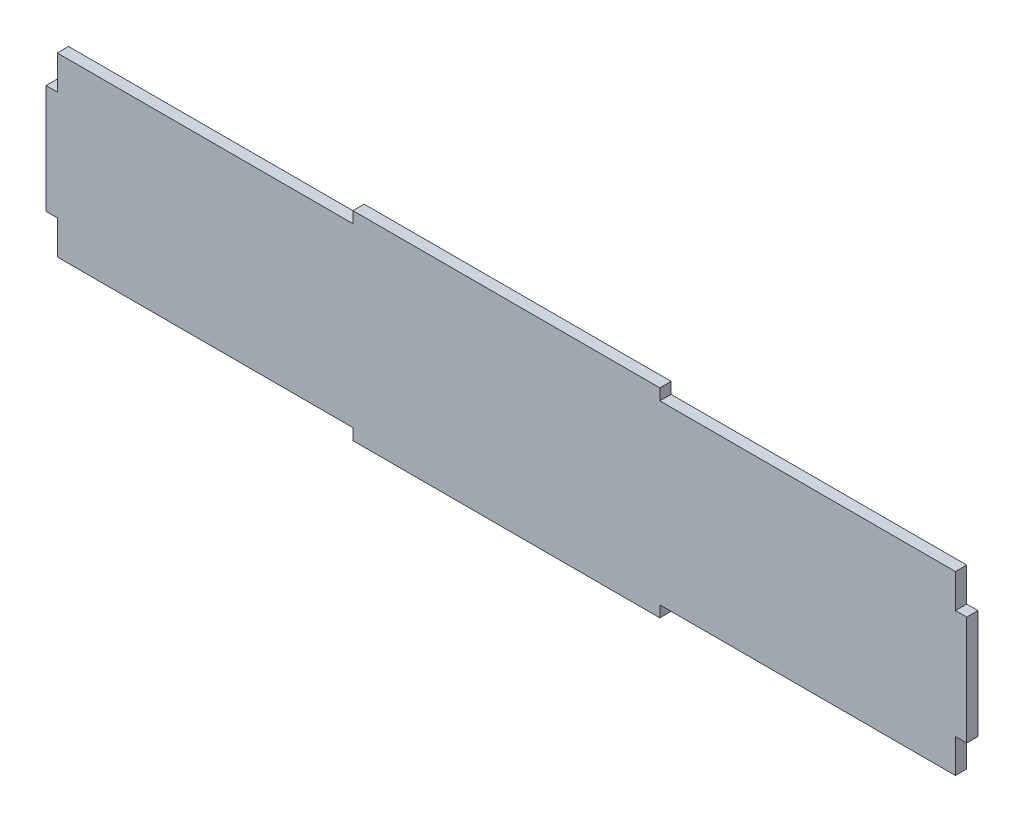
ISO-10303-21;
HEADER;
FILE_DESCRIPTION(('STEP AP214'),'2;1');
FILE_NAME('part.step','',(''),(''),'','','');
FILE_SCHEMA(('AUTOMOTIVE_DESIGN { 1 0 10303 214 1 1 1 1 }'));
ENDSEC;
DATA;
#1=APPLICATION_CONTEXT('core data for automotive mechanical design processes');
#2=APPLICATION_PROTOCOL_DEFINITION('international standard','automotive_design',2000,#1);
#3=PRODUCT_CONTEXT('',#1,'mechanical');
#4=PRODUCT('Part','Part','',(#3));
#5=PRODUCT_RELATED_PRODUCT_CATEGORY('part','',(#4));
#6=PRODUCT_DEFINITION_FORMATION('','',#4);
#7=PRODUCT_DEFINITION_CONTEXT('part definition',#1,'design');
#8=PRODUCT_DEFINITION('design','',#6,#7);
#9=PRODUCT_DEFINITION_SHAPE('','',#8);
#10=(LENGTH_UNIT() NAMED_UNIT(*) SI_UNIT(.MILLI.,.METRE.));
#11=(NAMED_UNIT(*) PLANE_ANGLE_UNIT() SI_UNIT($,.RADIAN.));
#12=(NAMED_UNIT(*) SI_UNIT($,.STERADIAN.) SOLID_ANGLE_UNIT());
#13=UNCERTAINTY_MEASURE_WITH_UNIT(LENGTH_MEASURE(1.E-05),#10,'distance_accuracy_value','');
#14=(GEOMETRIC_REPRESENTATION_CONTEXT(3) GLOBAL_UNCERTAINTY_ASSIGNED_CONTEXT((#13)) GLOBAL_UNIT_ASSIGNED_CONTEXT((#10,
#11,#12)) REPRESENTATION_CONTEXT('',''));
#15=CARTESIAN_POINT('',(0.,0.,0.));
#16=DIRECTION('',(0.,0.,1.));
#17=DIRECTION('',(1.,0.,0.));
#18=AXIS2_PLACEMENT_3D('',#15,#16,#17);
#19=CARTESIAN_POINT('',(0.,0.,6.));
#20=DIRECTION('',(1.,0.,0.));
#21=DIRECTION('',(0.,0.,-1.));
#22=AXIS2_PLACEMENT_3D('',#19,#20,#21);
#23=PLANE('',#22);
#24=DIRECTION('',(0.,-1.,0.));
#25=VECTOR('',#24,1.);
#26=CARTESIAN_POINT('',(0.,0.,6.));
#27=LINE('',#26,#25);
#28=CARTESIAN_POINT('',(0.,82.0199999999999,6.));
#29=VERTEX_POINT('',#28);
#30=CARTESIAN_POINT('',(0.,23.9999999999999,6.));
#31=VERTEX_POINT('',#30);
#32=EDGE_CURVE('E310',#29,#31,#27,.T.);
#33=ORIENTED_EDGE('',*,*,#32,.F.);
#34=DIRECTION('',(0.,0.,1.));
#35=VECTOR('',#34,1.);
#36=CARTESIAN_POINT('',(0.,82.0199999999999,0.));
#37=LINE('',#36,#35);
#38=CARTESIAN_POINT('',(0.,82.0199999999999,0.));
#39=VERTEX_POINT('',#38);
#40=EDGE_CURVE('E275',#39,#29,#37,.T.);
#41=ORIENTED_EDGE('',*,*,#40,.F.);
#42=DIRECTION('',(0.,-1.,0.));
#43=VECTOR('',#42,1.);
#44=CARTESIAN_POINT('',(0.,0.,0.));
#45=LINE('',#44,#43);
#46=CARTESIAN_POINT('',(0.,23.9999999999999,0.));
#47=VERTEX_POINT('',#46);
#48=EDGE_CURVE('E308',#39,#47,#45,.T.);
#49=ORIENTED_EDGE('',*,*,#48,.T.);
#50=DIRECTION('',(0.,0.,1.));
#51=VECTOR('',#50,1.);
#52=CARTESIAN_POINT('',(0.,23.9999999999999,0.));
#53=LINE('',#52,#51);
#54=EDGE_CURVE('E279',#47,#31,#53,.T.);
#55=ORIENTED_EDGE('',*,*,#54,.T.);
#56=EDGE_LOOP('',(#33,#41,#49,#55));
#57=FACE_BOUND('',#56,.T.);
#58=ADVANCED_FACE('F33',(#57),#23,.F.);
#59=CARTESIAN_POINT('',(0.,0.,6.));
#60=DIRECTION('',(0.,1.,0.));
#61=DIRECTION('',(0.,0.,1.));
#62=AXIS2_PLACEMENT_3D('',#59,#60,#61);
#63=PLANE('',#62);
#64=DIRECTION('',(1.,0.,0.));
#65=VECTOR('',#64,1.);
#66=CARTESIAN_POINT('',(0.,0.,0.));
#67=LINE('',#66,#65);
#68=CARTESIAN_POINT('',(163.333333333333,0.,0.));
#69=VERTEX_POINT('',#68);
#70=CARTESIAN_POINT('',(326.666666666667,0.,0.));
#71=VERTEX_POINT('',#70);
#72=EDGE_CURVE('E320',#69,#71,#67,.T.);
#73=ORIENTED_EDGE('',*,*,#72,.T.);
#74=DIRECTION('',(0.,0.,1.));
#75=VECTOR('',#74,1.);
#76=CARTESIAN_POINT('',(326.666666666667,0.,0.));
#77=LINE('',#76,#75);
#78=CARTESIAN_POINT('',(326.666666666667,0.,6.));
#79=VERTEX_POINT('',#78);
#80=EDGE_CURVE('E176',#71,#79,#77,.T.);
#81=ORIENTED_EDGE('',*,*,#80,.T.);
#82=DIRECTION('',(1.,0.,0.));
#83=VECTOR('',#82,1.);
#84=CARTESIAN_POINT('',(0.,0.,6.));
#85=LINE('',#84,#83);
#86=CARTESIAN_POINT('',(163.333333333333,0.,6.));
#87=VERTEX_POINT('',#86);
#88=EDGE_CURVE('E313',#87,#79,#85,.T.);
#89=ORIENTED_EDGE('',*,*,#88,.F.);
#90=DIRECTION('',(0.,0.,1.));
#91=VECTOR('',#90,1.);
#92=CARTESIAN_POINT('',(163.333333333333,0.,0.));
#93=LINE('',#92,#91);
#94=EDGE_CURVE('E240',#69,#87,#93,.T.);
#95=ORIENTED_EDGE('',*,*,#94,.F.);
#96=EDGE_LOOP('',(#73,#81,#89,#95));
#97=FACE_BOUND('',#96,.T.);
#98=ADVANCED_FACE('F368',(#97),#63,.F.);
#99=CARTESIAN_POINT('',(490.,0.,6.));
#100=DIRECTION('',(-1.,0.,0.));
#101=DIRECTION('',(0.,0.,1.));
#102=AXIS2_PLACEMENT_3D('',#99,#100,#101);
#103=PLANE('',#102);
#104=DIRECTION('',(0.,1.,0.));
#105=VECTOR('',#104,1.);
#106=CARTESIAN_POINT('',(490.,0.,0.));
#107=LINE('',#106,#105);
#108=CARTESIAN_POINT('',(490.,24.,0.));
#109=VERTEX_POINT('',#108);
#110=CARTESIAN_POINT('',(490.,82.02,0.));
#111=VERTEX_POINT('',#110);
#112=EDGE_CURVE('E321',#109,#111,#107,.T.);
#113=ORIENTED_EDGE('',*,*,#112,.T.);
#114=DIRECTION('',(0.,0.,1.));
#115=VECTOR('',#114,1.);
#116=CARTESIAN_POINT('',(490.,82.02,0.));
#117=LINE('',#116,#115);
#118=CARTESIAN_POINT('',(490.,82.02,6.));
#119=VERTEX_POINT('',#118);
#120=EDGE_CURVE('E262',#111,#119,#117,.T.);
#121=ORIENTED_EDGE('',*,*,#120,.T.);
#122=DIRECTION('',(0.,1.,0.));
#123=VECTOR('',#122,1.);
#124=CARTESIAN_POINT('',(490.,0.,6.));
#125=LINE('',#124,#123);
#126=CARTESIAN_POINT('',(490.,24.,6.));
#127=VERTEX_POINT('',#126);
#128=EDGE_CURVE('E41',#127,#119,#125,.T.);
#129=ORIENTED_EDGE('',*,*,#128,.F.);
#130=DIRECTION('',(0.,0.,1.));
#131=VECTOR('',#130,1.);
#132=CARTESIAN_POINT('',(490.,24.,0.));
#133=LINE('',#132,#131);
#134=EDGE_CURVE('E301',#109,#127,#133,.T.);
#135=ORIENTED_EDGE('',*,*,#134,.F.);
#136=EDGE_LOOP('',(#113,#121,#129,#135));
#137=FACE_BOUND('',#136,.T.);
#138=ADVANCED_FACE('F359',(#137),#103,.F.);
#139=CARTESIAN_POINT('',(0.,106.02,6.));
#140=DIRECTION('',(0.,-1.,0.));
#141=DIRECTION('',(0.,0.,-1.));
#142=AXIS2_PLACEMENT_3D('',#139,#140,#141);
#143=PLANE('',#142);
#144=DIRECTION('',(-1.,0.,0.));
#145=VECTOR('',#144,1.);
#146=CARTESIAN_POINT('',(0.,106.02,0.));
#147=LINE('',#146,#145);
#148=CARTESIAN_POINT('',(326.666666666667,106.02,0.));
#149=VERTEX_POINT('',#148);
#150=CARTESIAN_POINT('',(163.333333333333,106.02,0.));
#151=VERTEX_POINT('',#150);
#152=EDGE_CURVE('E36',#149,#151,#147,.T.);
#153=ORIENTED_EDGE('',*,*,#152,.T.);
#154=DIRECTION('',(0.,0.,1.));
#155=VECTOR('',#154,1.);
#156=CARTESIAN_POINT('',(163.333333333333,106.02,0.));
#157=LINE('',#156,#155);
#158=CARTESIAN_POINT('',(163.333333333333,106.02,6.));
#159=VERTEX_POINT('',#158);
#160=EDGE_CURVE('E195',#151,#159,#157,.T.);
#161=ORIENTED_EDGE('',*,*,#160,.T.);
#162=DIRECTION('',(-1.,0.,0.));
#163=VECTOR('',#162,1.);
#164=CARTESIAN_POINT('',(0.,106.02,6.));
#165=LINE('',#164,#163);
#166=CARTESIAN_POINT('',(326.666666666667,106.02,6.));
#167=VERTEX_POINT('',#166);
#168=EDGE_CURVE('E11',#167,#159,#165,.T.);
#169=ORIENTED_EDGE('',*,*,#168,.F.);
#170=DIRECTION('',(0.,0.,1.));
#171=VECTOR('',#170,1.);
#172=CARTESIAN_POINT('',(326.666666666667,106.02,0.));
#173=LINE('',#172,#171);
#174=EDGE_CURVE('E223',#149,#167,#173,.T.);
#175=ORIENTED_EDGE('',*,*,#174,.F.);
#176=EDGE_LOOP('',(#153,#161,#169,#175));
#177=FACE_BOUND('',#176,.T.);
#178=ADVANCED_FACE('F330',(#177),#143,.F.);
#179=CARTESIAN_POINT('',(0.,0.,6.));
#180=DIRECTION('',(0.,0.,-1.));
#181=DIRECTION('',(-1.,0.,0.));
#182=AXIS2_PLACEMENT_3D('',#179,#180,#181);
#183=PLANE('',#182);
#184=ORIENTED_EDGE('',*,*,#88,.T.);
#185=DIRECTION('',(0.,-1.,0.));
#186=VECTOR('',#185,1.);
#187=CARTESIAN_POINT('',(326.666666666667,0.,6.));
#188=LINE('',#187,#186);
#189=CARTESIAN_POINT('',(326.666666666667,5.99999999999998,6.));
#190=VERTEX_POINT('',#189);
#191=EDGE_CURVE('E191',#190,#79,#188,.T.);
#192=ORIENTED_EDGE('',*,*,#191,.F.);
#193=DIRECTION('',(-1.,0.,0.));
#194=VECTOR('',#193,1.);
#195=CARTESIAN_POINT('',(484.,6.,6.));
#196=LINE('',#195,#194);
#197=CARTESIAN_POINT('',(484.,6.,6.));
#198=VERTEX_POINT('',#197);
#199=EDGE_CURVE('E173',#198,#190,#196,.T.);
#200=ORIENTED_EDGE('',*,*,#199,.F.);
#201=DIRECTION('',(0.,-1.,0.));
#202=VECTOR('',#201,1.);
#203=CARTESIAN_POINT('',(484.,0.,6.));
#204=LINE('',#203,#202);
#205=CARTESIAN_POINT('',(484.,24.,6.));
#206=VERTEX_POINT('',#205);
#207=EDGE_CURVE('E299',#206,#198,#204,.T.);
#208=ORIENTED_EDGE('',*,*,#207,.F.);
#209=DIRECTION('',(-1.,0.,0.));
#210=VECTOR('',#209,1.);
#211=CARTESIAN_POINT('',(490.,24.,6.));
#212=LINE('',#211,#210);
#213=EDGE_CURVE('E265',#127,#206,#212,.T.);
#214=ORIENTED_EDGE('',*,*,#213,.F.);
#215=ORIENTED_EDGE('',*,*,#128,.T.);
#216=DIRECTION('',(1.,0.,0.));
#217=VECTOR('',#216,1.);
#218=CARTESIAN_POINT('',(490.,82.02,6.));
#219=LINE('',#218,#217);
#220=CARTESIAN_POINT('',(484.,82.02,6.));
#221=VERTEX_POINT('',#220);
#222=EDGE_CURVE('E254',#221,#119,#219,.T.);
#223=ORIENTED_EDGE('',*,*,#222,.F.);
#224=DIRECTION('',(0.,-1.,0.));
#225=VECTOR('',#224,1.);
#226=CARTESIAN_POINT('',(484.,106.02,6.));
#227=LINE('',#226,#225);
#228=CARTESIAN_POINT('',(484.,100.02,6.));
#229=VERTEX_POINT('',#228);
#230=EDGE_CURVE('E258',#229,#221,#227,.T.);
#231=ORIENTED_EDGE('',*,*,#230,.F.);
#232=DIRECTION('',(1.,0.,0.));
#233=VECTOR('',#232,1.);
#234=CARTESIAN_POINT('',(484.,100.02,6.));
#235=LINE('',#234,#233);
#236=CARTESIAN_POINT('',(326.666666666667,100.02,6.));
#237=VERTEX_POINT('',#236);
#238=EDGE_CURVE('E220',#237,#229,#235,.T.);
#239=ORIENTED_EDGE('',*,*,#238,.F.);
#240=DIRECTION('',(0.,-1.,0.));
#241=VECTOR('',#240,1.);
#242=CARTESIAN_POINT('',(326.666666666667,106.02,6.));
#243=LINE('',#242,#241);
#244=EDGE_CURVE('E224',#167,#237,#243,.T.);
#245=ORIENTED_EDGE('',*,*,#244,.F.);
#246=ORIENTED_EDGE('',*,*,#168,.T.);
#247=DIRECTION('',(0.,1.,0.));
#248=VECTOR('',#247,1.);
#249=CARTESIAN_POINT('',(163.333333333333,106.02,6.));
#250=LINE('',#249,#248);
#251=CARTESIAN_POINT('',(163.333333333333,100.02,6.));
#252=VERTEX_POINT('',#251);
#253=EDGE_CURVE('E202',#252,#159,#250,.T.);
#254=ORIENTED_EDGE('',*,*,#253,.F.);
#255=DIRECTION('',(1.,0.,0.));
#256=VECTOR('',#255,1.);
#257=CARTESIAN_POINT('',(5.99999999999996,100.02,6.));
#258=LINE('',#257,#256);
#259=CARTESIAN_POINT('',(5.99999999999996,100.02,6.));
#260=VERTEX_POINT('',#259);
#261=EDGE_CURVE('E206',#260,#252,#258,.T.);
#262=ORIENTED_EDGE('',*,*,#261,.F.);
#263=DIRECTION('',(0.,1.,0.));
#264=VECTOR('',#263,1.);
#265=CARTESIAN_POINT('',(5.99999999999995,106.02,6.));
#266=LINE('',#265,#264);
#267=CARTESIAN_POINT('',(5.99999999999995,82.0199999999999,6.));
#268=VERTEX_POINT('',#267);
#269=EDGE_CURVE('E272',#268,#260,#266,.T.);
#270=ORIENTED_EDGE('',*,*,#269,.F.);
#271=DIRECTION('',(1.,0.,0.));
#272=VECTOR('',#271,1.);
#273=CARTESIAN_POINT('',(0.,82.0199999999999,6.));
#274=LINE('',#273,#272);
#275=EDGE_CURVE('E276',#29,#268,#274,.T.);
#276=ORIENTED_EDGE('',*,*,#275,.F.);
#277=ORIENTED_EDGE('',*,*,#32,.T.);
#278=DIRECTION('',(-1.,0.,0.));
#279=VECTOR('',#278,1.);
#280=CARTESIAN_POINT('',(0.,23.9999999999999,6.));
#281=LINE('',#280,#279);
#282=CARTESIAN_POINT('',(5.99999999999996,23.9999999999999,6.));
#283=VERTEX_POINT('',#282);
#284=EDGE_CURVE('E287',#283,#31,#281,.T.);
#285=ORIENTED_EDGE('',*,*,#284,.F.);
#286=DIRECTION('',(0.,1.,0.));
#287=VECTOR('',#286,1.);
#288=CARTESIAN_POINT('',(5.99999999999996,0.,6.));
#289=LINE('',#288,#287);
#290=CARTESIAN_POINT('',(5.99999999999996,6.,6.));
#291=VERTEX_POINT('',#290);
#292=EDGE_CURVE('E247',#291,#283,#289,.T.);
#293=ORIENTED_EDGE('',*,*,#292,.F.);
#294=DIRECTION('',(-1.,0.,0.));
#295=VECTOR('',#294,1.);
#296=CARTESIAN_POINT('',(5.99999999999996,6.,6.));
#297=LINE('',#296,#295);
#298=CARTESIAN_POINT('',(163.333333333333,6.,6.));
#299=VERTEX_POINT('',#298);
#300=EDGE_CURVE('E237',#299,#291,#297,.T.);
#301=ORIENTED_EDGE('',*,*,#300,.F.);
#302=DIRECTION('',(0.,1.,0.));
#303=VECTOR('',#302,1.);
#304=CARTESIAN_POINT('',(163.333333333333,0.,6.));
#305=LINE('',#304,#303);
#306=EDGE_CURVE('E197',#87,#299,#305,.T.);
#307=ORIENTED_EDGE('',*,*,#306,.F.);
#308=EDGE_LOOP('',(#184,#192,#200,#208,#214,#215,#223,#231,#239,#245,#246,#254,#262,#270,#276,
#277,#285,#293,#301,#307));
#309=FACE_BOUND('',#308,.T.);
#310=ADVANCED_FACE('F338',(#309),#183,.F.);
#311=CARTESIAN_POINT('',(0.,0.,0.));
#312=DIRECTION('',(0.,0.,-1.));
#313=DIRECTION('',(-1.,0.,0.));
#314=AXIS2_PLACEMENT_3D('',#311,#312,#313);
#315=PLANE('',#314);
#316=DIRECTION('',(0.,-1.,0.));
#317=VECTOR('',#316,1.);
#318=CARTESIAN_POINT('',(326.666666666667,0.,0.));
#319=LINE('',#318,#317);
#320=CARTESIAN_POINT('',(326.666666666667,5.99999999999998,0.));
#321=VERTEX_POINT('',#320);
#322=EDGE_CURVE('E180',#321,#71,#319,.T.);
#323=ORIENTED_EDGE('',*,*,#322,.T.);
#324=ORIENTED_EDGE('',*,*,#72,.F.);
#325=DIRECTION('',(0.,1.,0.));
#326=VECTOR('',#325,1.);
#327=CARTESIAN_POINT('',(163.333333333333,0.,0.));
#328=LINE('',#327,#326);
#329=CARTESIAN_POINT('',(163.333333333333,6.,0.));
#330=VERTEX_POINT('',#329);
#331=EDGE_CURVE('E233',#69,#330,#328,.T.);
#332=ORIENTED_EDGE('',*,*,#331,.T.);
#333=DIRECTION('',(-1.,0.,0.));
#334=VECTOR('',#333,1.);
#335=CARTESIAN_POINT('',(5.99999999999996,6.,0.));
#336=LINE('',#335,#334);
#337=CARTESIAN_POINT('',(5.99999999999996,6.,0.));
#338=VERTEX_POINT('',#337);
#339=EDGE_CURVE('E236',#330,#338,#336,.T.);
#340=ORIENTED_EDGE('',*,*,#339,.T.);
#341=DIRECTION('',(0.,1.,0.));
#342=VECTOR('',#341,1.);
#343=CARTESIAN_POINT('',(5.99999999999996,0.,0.));
#344=LINE('',#343,#342);
#345=CARTESIAN_POINT('',(5.99999999999996,23.9999999999999,0.));
#346=VERTEX_POINT('',#345);
#347=EDGE_CURVE('E284',#338,#346,#344,.T.);
#348=ORIENTED_EDGE('',*,*,#347,.T.);
#349=DIRECTION('',(-1.,0.,0.));
#350=VECTOR('',#349,1.);
#351=CARTESIAN_POINT('',(0.,23.9999999999999,0.));
#352=LINE('',#351,#350);
#353=EDGE_CURVE('E286',#346,#47,#352,.T.);
#354=ORIENTED_EDGE('',*,*,#353,.T.);
#355=ORIENTED_EDGE('',*,*,#48,.F.);
#356=DIRECTION('',(1.,0.,0.));
#357=VECTOR('',#356,1.);
#358=CARTESIAN_POINT('',(0.,82.0199999999999,0.));
#359=LINE('',#358,#357);
#360=CARTESIAN_POINT('',(5.99999999999995,82.0199999999999,0.));
#361=VERTEX_POINT('',#360);
#362=EDGE_CURVE('E268',#39,#361,#359,.T.);
#363=ORIENTED_EDGE('',*,*,#362,.T.);
#364=DIRECTION('',(0.,1.,0.));
#365=VECTOR('',#364,1.);
#366=CARTESIAN_POINT('',(5.99999999999995,106.02,0.));
#367=LINE('',#366,#365);
#368=CARTESIAN_POINT('',(5.99999999999995,100.02,0.));
#369=VERTEX_POINT('',#368);
#370=EDGE_CURVE('E271',#361,#369,#367,.T.);
#371=ORIENTED_EDGE('',*,*,#370,.T.);
#372=DIRECTION('',(1.,0.,0.));
#373=VECTOR('',#372,1.);
#374=CARTESIAN_POINT('',(5.99999999999996,100.02,0.));
#375=LINE('',#374,#373);
#376=CARTESIAN_POINT('',(163.333333333333,100.02,0.));
#377=VERTEX_POINT('',#376);
#378=EDGE_CURVE('E57',#369,#377,#375,.T.);
#379=ORIENTED_EDGE('',*,*,#378,.T.);
#380=DIRECTION('',(0.,1.,0.));
#381=VECTOR('',#380,1.);
#382=CARTESIAN_POINT('',(163.333333333333,106.02,0.));
#383=LINE('',#382,#381);
#384=EDGE_CURVE('E201',#377,#151,#383,.T.);
#385=ORIENTED_EDGE('',*,*,#384,.T.);
#386=ORIENTED_EDGE('',*,*,#152,.F.);
#387=DIRECTION('',(0.,-1.,0.));
#388=VECTOR('',#387,1.);
#389=CARTESIAN_POINT('',(326.666666666667,106.02,0.));
#390=LINE('',#389,#388);
#391=CARTESIAN_POINT('',(326.666666666667,100.02,0.));
#392=VERTEX_POINT('',#391);
#393=EDGE_CURVE('E216',#149,#392,#390,.T.);
#394=ORIENTED_EDGE('',*,*,#393,.T.);
#395=DIRECTION('',(1.,0.,0.));
#396=VECTOR('',#395,1.);
#397=CARTESIAN_POINT('',(484.,100.02,0.));
#398=LINE('',#397,#396);
#399=CARTESIAN_POINT('',(484.,100.02,0.));
#400=VERTEX_POINT('',#399);
#401=EDGE_CURVE('E219',#392,#400,#398,.T.);
#402=ORIENTED_EDGE('',*,*,#401,.T.);
#403=DIRECTION('',(0.,-1.,0.));
#404=VECTOR('',#403,1.);
#405=CARTESIAN_POINT('',(484.,106.02,0.));
#406=LINE('',#405,#404);
#407=CARTESIAN_POINT('',(484.,82.02,0.));
#408=VERTEX_POINT('',#407);
#409=EDGE_CURVE('E251',#400,#408,#406,.T.);
#410=ORIENTED_EDGE('',*,*,#409,.T.);
#411=DIRECTION('',(1.,0.,0.));
#412=VECTOR('',#411,1.);
#413=CARTESIAN_POINT('',(490.,82.02,0.));
#414=LINE('',#413,#412);
#415=EDGE_CURVE('E253',#408,#111,#414,.T.);
#416=ORIENTED_EDGE('',*,*,#415,.T.);
#417=ORIENTED_EDGE('',*,*,#112,.F.);
#418=DIRECTION('',(-1.,0.,0.));
#419=VECTOR('',#418,1.);
#420=CARTESIAN_POINT('',(490.,24.,0.));
#421=LINE('',#420,#419);
#422=CARTESIAN_POINT('',(484.,24.,0.));
#423=VERTEX_POINT('',#422);
#424=EDGE_CURVE('E297',#109,#423,#421,.T.);
#425=ORIENTED_EDGE('',*,*,#424,.T.);
#426=DIRECTION('',(0.,-1.,0.));
#427=VECTOR('',#426,1.);
#428=CARTESIAN_POINT('',(484.,0.,0.));
#429=LINE('',#428,#427);
#430=CARTESIAN_POINT('',(484.,6.,0.));
#431=VERTEX_POINT('',#430);
#432=EDGE_CURVE('E190',#423,#431,#429,.T.);
#433=ORIENTED_EDGE('',*,*,#432,.T.);
#434=DIRECTION('',(-1.,0.,0.));
#435=VECTOR('',#434,1.);
#436=CARTESIAN_POINT('',(484.,6.,0.));
#437=LINE('',#436,#435);
#438=EDGE_CURVE('E49',#431,#321,#437,.T.);
#439=ORIENTED_EDGE('',*,*,#438,.T.);
#440=EDGE_LOOP('',(#323,#324,#332,#340,#348,#354,#355,#363,#371,#379,#385,#386,#394,#402,#410,
#416,#417,#425,#433,#439));
#441=FACE_BOUND('',#440,.T.);
#442=ADVANCED_FACE('F188',(#441),#315,.T.);
#443=CARTESIAN_POINT('',(484.,0.,0.));
#444=DIRECTION('',(-1.,0.,0.));
#445=DIRECTION('',(0.,0.,1.));
#446=AXIS2_PLACEMENT_3D('',#443,#444,#445);
#447=PLANE('',#446);
#448=ORIENTED_EDGE('',*,*,#207,.T.);
#449=DIRECTION('',(0.,0.,1.));
#450=VECTOR('',#449,1.);
#451=CARTESIAN_POINT('',(484.,6.,0.));
#452=LINE('',#451,#450);
#453=EDGE_CURVE('E177',#431,#198,#452,.T.);
#454=ORIENTED_EDGE('',*,*,#453,.F.);
#455=ORIENTED_EDGE('',*,*,#432,.F.);
#456=DIRECTION('',(0.,0.,1.));
#457=VECTOR('',#456,1.);
#458=CARTESIAN_POINT('',(484.,24.,0.));
#459=LINE('',#458,#457);
#460=EDGE_CURVE('E306',#423,#206,#459,.T.);
#461=ORIENTED_EDGE('',*,*,#460,.T.);
#462=EDGE_LOOP('',(#448,#454,#455,#461));
#463=FACE_BOUND('',#462,.T.);
#464=ADVANCED_FACE('F364',(#463),#447,.F.);
#465=CARTESIAN_POINT('',(490.,24.,0.));
#466=DIRECTION('',(0.,1.,0.));
#467=DIRECTION('',(0.,0.,1.));
#468=AXIS2_PLACEMENT_3D('',#465,#466,#467);
#469=PLANE('',#468);
#470=ORIENTED_EDGE('',*,*,#213,.T.);
#471=ORIENTED_EDGE('',*,*,#460,.F.);
#472=ORIENTED_EDGE('',*,*,#424,.F.);
#473=ORIENTED_EDGE('',*,*,#134,.T.);
#474=EDGE_LOOP('',(#470,#471,#472,#473));
#475=FACE_BOUND('',#474,.T.);
#476=ADVANCED_FACE('F362',(#475),#469,.F.);
#477=CARTESIAN_POINT('',(0.,23.9999999999999,0.));
#478=DIRECTION('',(0.,1.,0.));
#479=DIRECTION('',(-1.,0.,0.));
#480=AXIS2_PLACEMENT_3D('',#477,#478,#479);
#481=PLANE('',#480);
#482=ORIENTED_EDGE('',*,*,#284,.T.);
#483=ORIENTED_EDGE('',*,*,#54,.F.);
#484=ORIENTED_EDGE('',*,*,#353,.F.);
#485=DIRECTION('',(0.,0.,1.));
#486=VECTOR('',#485,1.);
#487=CARTESIAN_POINT('',(5.99999999999996,23.9999999999999,0.));
#488=LINE('',#487,#486);
#489=EDGE_CURVE('E290',#346,#283,#488,.T.);
#490=ORIENTED_EDGE('',*,*,#489,.T.);
#491=EDGE_LOOP('',(#482,#483,#484,#490));
#492=FACE_BOUND('',#491,.T.);
#493=ADVANCED_FACE('F385',(#492),#481,.F.);
#494=CARTESIAN_POINT('',(5.99999999999996,0.,0.));
#495=DIRECTION('',(1.,0.,0.));
#496=DIRECTION('',(0.,0.,-1.));
#497=AXIS2_PLACEMENT_3D('',#494,#495,#496);
#498=PLANE('',#497);
#499=ORIENTED_EDGE('',*,*,#347,.F.);
#500=DIRECTION('',(0.,0.,1.));
#501=VECTOR('',#500,1.);
#502=CARTESIAN_POINT('',(5.99999999999996,6.,0.));
#503=LINE('',#502,#501);
#504=EDGE_CURVE('E244',#338,#291,#503,.T.);
#505=ORIENTED_EDGE('',*,*,#504,.T.);
#506=ORIENTED_EDGE('',*,*,#292,.T.);
#507=ORIENTED_EDGE('',*,*,#489,.F.);
#508=EDGE_LOOP('',(#499,#505,#506,#507));
#509=FACE_BOUND('',#508,.T.);
#510=ADVANCED_FACE('F379',(#509),#498,.F.);
#511=CARTESIAN_POINT('',(5.99999999999995,106.02,0.));
#512=DIRECTION('',(1.,0.,0.));
#513=DIRECTION('',(0.,1.,0.));
#514=AXIS2_PLACEMENT_3D('',#511,#512,#513);
#515=PLANE('',#514);
#516=ORIENTED_EDGE('',*,*,#269,.T.);
#517=DIRECTION('',(0.,0.,1.));
#518=VECTOR('',#517,1.);
#519=CARTESIAN_POINT('',(5.99999999999996,100.02,0.));
#520=LINE('',#519,#518);
#521=EDGE_CURVE('E205',#369,#260,#520,.T.);
#522=ORIENTED_EDGE('',*,*,#521,.F.);
#523=ORIENTED_EDGE('',*,*,#370,.F.);
#524=DIRECTION('',(0.,0.,1.));
#525=VECTOR('',#524,1.);
#526=CARTESIAN_POINT('',(5.99999999999995,82.0199999999999,0.));
#527=LINE('',#526,#525);
#528=EDGE_CURVE('E260',#361,#268,#527,.T.);
#529=ORIENTED_EDGE('',*,*,#528,.T.);
#530=EDGE_LOOP('',(#516,#522,#523,#529));
#531=FACE_BOUND('',#530,.T.);
#532=ADVANCED_FACE('F394',(#531),#515,.F.);
#533=CARTESIAN_POINT('',(0.,82.0199999999999,0.));
#534=DIRECTION('',(0.,-1.,0.));
#535=DIRECTION('',(0.,0.,-1.));
#536=AXIS2_PLACEMENT_3D('',#533,#534,#535);
#537=PLANE('',#536);
#538=ORIENTED_EDGE('',*,*,#275,.T.);
#539=ORIENTED_EDGE('',*,*,#528,.F.);
#540=ORIENTED_EDGE('',*,*,#362,.F.);
#541=ORIENTED_EDGE('',*,*,#40,.T.);
#542=EDGE_LOOP('',(#538,#539,#540,#541));
#543=FACE_BOUND('',#542,.T.);
#544=ADVANCED_FACE('F392',(#543),#537,.F.);
#545=CARTESIAN_POINT('',(490.,82.02,0.));
#546=DIRECTION('',(0.,-1.,0.));
#547=DIRECTION('',(0.,0.,-1.));
#548=AXIS2_PLACEMENT_3D('',#545,#546,#547);
#549=PLANE('',#548);
#550=ORIENTED_EDGE('',*,*,#222,.T.);
#551=ORIENTED_EDGE('',*,*,#120,.F.);
#552=ORIENTED_EDGE('',*,*,#415,.F.);
#553=DIRECTION('',(0.,0.,1.));
#554=VECTOR('',#553,1.);
#555=CARTESIAN_POINT('',(484.,82.02,0.));
#556=LINE('',#555,#554);
#557=EDGE_CURVE('E257',#408,#221,#556,.T.);
#558=ORIENTED_EDGE('',*,*,#557,.T.);
#559=EDGE_LOOP('',(#550,#551,#552,#558));
#560=FACE_BOUND('',#559,.T.);
#561=ADVANCED_FACE('F355',(#560),#549,.F.);
#562=CARTESIAN_POINT('',(484.,106.02,0.));
#563=DIRECTION('',(-1.,0.,0.));
#564=DIRECTION('',(0.,0.,1.));
#565=AXIS2_PLACEMENT_3D('',#562,#563,#564);
#566=PLANE('',#565);
#567=ORIENTED_EDGE('',*,*,#409,.F.);
#568=DIRECTION('',(0.,0.,1.));
#569=VECTOR('',#568,1.);
#570=CARTESIAN_POINT('',(484.,100.02,0.));
#571=LINE('',#570,#569);
#572=EDGE_CURVE('E209',#400,#229,#571,.T.);
#573=ORIENTED_EDGE('',*,*,#572,.T.);
#574=ORIENTED_EDGE('',*,*,#230,.T.);
#575=ORIENTED_EDGE('',*,*,#557,.F.);
#576=EDGE_LOOP('',(#567,#573,#574,#575));
#577=FACE_BOUND('',#576,.T.);
#578=ADVANCED_FACE('F352',(#577),#566,.F.);
#579=CARTESIAN_POINT('',(5.99999999999996,6.,0.));
#580=DIRECTION('',(0.,1.,0.));
#581=DIRECTION('',(0.,0.,1.));
#582=AXIS2_PLACEMENT_3D('',#579,#580,#581);
#583=PLANE('',#582);
#584=ORIENTED_EDGE('',*,*,#300,.T.);
#585=ORIENTED_EDGE('',*,*,#504,.F.);
#586=ORIENTED_EDGE('',*,*,#339,.F.);
#587=DIRECTION('',(0.,0.,1.));
#588=VECTOR('',#587,1.);
#589=CARTESIAN_POINT('',(163.333333333333,6.,0.));
#590=LINE('',#589,#588);
#591=EDGE_CURVE('E248',#330,#299,#590,.T.);
#592=ORIENTED_EDGE('',*,*,#591,.T.);
#593=EDGE_LOOP('',(#584,#585,#586,#592));
#594=FACE_BOUND('',#593,.T.);
#595=ADVANCED_FACE('F376',(#594),#583,.F.);
#596=CARTESIAN_POINT('',(163.333333333333,0.,0.));
#597=DIRECTION('',(1.,0.,0.));
#598=DIRECTION('',(0.,0.,-1.));
#599=AXIS2_PLACEMENT_3D('',#596,#597,#598);
#600=PLANE('',#599);
#601=ORIENTED_EDGE('',*,*,#306,.T.);
#602=ORIENTED_EDGE('',*,*,#591,.F.);
#603=ORIENTED_EDGE('',*,*,#331,.F.);
#604=ORIENTED_EDGE('',*,*,#94,.T.);
#605=EDGE_LOOP('',(#601,#602,#603,#604));
#606=FACE_BOUND('',#605,.T.);
#607=ADVANCED_FACE('F373',(#606),#600,.F.);
#608=CARTESIAN_POINT('',(484.,100.02,0.));
#609=DIRECTION('',(0.,-1.,0.));
#610=DIRECTION('',(1.,0.,0.));
#611=AXIS2_PLACEMENT_3D('',#608,#609,#610);
#612=PLANE('',#611);
#613=ORIENTED_EDGE('',*,*,#238,.T.);
#614=ORIENTED_EDGE('',*,*,#572,.F.);
#615=ORIENTED_EDGE('',*,*,#401,.F.);
#616=DIRECTION('',(0.,0.,1.));
#617=VECTOR('',#616,1.);
#618=CARTESIAN_POINT('',(326.666666666667,100.02,0.));
#619=LINE('',#618,#617);
#620=EDGE_CURVE('E230',#392,#237,#619,.T.);
#621=ORIENTED_EDGE('',*,*,#620,.T.);
#622=EDGE_LOOP('',(#613,#614,#615,#621));
#623=FACE_BOUND('',#622,.T.);
#624=ADVANCED_FACE('F347',(#623),#612,.F.);
#625=CARTESIAN_POINT('',(326.666666666667,106.02,0.));
#626=DIRECTION('',(-1.,0.,0.));
#627=DIRECTION('',(0.,0.,1.));
#628=AXIS2_PLACEMENT_3D('',#625,#626,#627);
#629=PLANE('',#628);
#630=ORIENTED_EDGE('',*,*,#244,.T.);
#631=ORIENTED_EDGE('',*,*,#620,.F.);
#632=ORIENTED_EDGE('',*,*,#393,.F.);
#633=ORIENTED_EDGE('',*,*,#174,.T.);
#634=EDGE_LOOP('',(#630,#631,#632,#633));
#635=FACE_BOUND('',#634,.T.);
#636=ADVANCED_FACE('F344',(#635),#629,.F.);
#637=CARTESIAN_POINT('',(163.333333333333,106.02,0.));
#638=DIRECTION('',(1.,0.,0.));
#639=DIRECTION('',(0.,0.,-1.));
#640=AXIS2_PLACEMENT_3D('',#637,#638,#639);
#641=PLANE('',#640);
#642=ORIENTED_EDGE('',*,*,#253,.T.);
#643=ORIENTED_EDGE('',*,*,#160,.F.);
#644=ORIENTED_EDGE('',*,*,#384,.F.);
#645=DIRECTION('',(0.,0.,1.));
#646=VECTOR('',#645,1.);
#647=CARTESIAN_POINT('',(163.333333333333,100.02,0.));
#648=LINE('',#647,#646);
#649=EDGE_CURVE('E213',#377,#252,#648,.T.);
#650=ORIENTED_EDGE('',*,*,#649,.T.);
#651=EDGE_LOOP('',(#642,#643,#644,#650));
#652=FACE_BOUND('',#651,.T.);
#653=ADVANCED_FACE('F334',(#652),#641,.F.);
#654=CARTESIAN_POINT('',(5.99999999999996,100.02,0.));
#655=DIRECTION('',(0.,-1.,0.));
#656=DIRECTION('',(0.,0.,-1.));
#657=AXIS2_PLACEMENT_3D('',#654,#655,#656);
#658=PLANE('',#657);
#659=ORIENTED_EDGE('',*,*,#261,.T.);
#660=ORIENTED_EDGE('',*,*,#649,.F.);
#661=ORIENTED_EDGE('',*,*,#378,.F.);
#662=ORIENTED_EDGE('',*,*,#521,.T.);
#663=EDGE_LOOP('',(#659,#660,#661,#662));
#664=FACE_BOUND('',#663,.T.);
#665=ADVANCED_FACE('F395',(#664),#658,.F.);
#666=CARTESIAN_POINT('',(326.666666666667,0.,0.));
#667=DIRECTION('',(-1.,0.,0.));
#668=DIRECTION('',(0.,0.,1.));
#669=AXIS2_PLACEMENT_3D('',#666,#667,#668);
#670=PLANE('',#669);
#671=ORIENTED_EDGE('',*,*,#191,.T.);
#672=ORIENTED_EDGE('',*,*,#80,.F.);
#673=ORIENTED_EDGE('',*,*,#322,.F.);
#674=DIRECTION('',(0.,0.,1.));
#675=VECTOR('',#674,1.);
#676=CARTESIAN_POINT('',(326.666666666667,5.99999999999998,0.));
#677=LINE('',#676,#675);
#678=EDGE_CURVE('E169',#321,#190,#677,.T.);
#679=ORIENTED_EDGE('',*,*,#678,.T.);
#680=EDGE_LOOP('',(#671,#672,#673,#679));
#681=FACE_BOUND('',#680,.T.);
#682=ADVANCED_FACE('F181',(#681),#670,.F.);
#683=CARTESIAN_POINT('',(484.,6.,0.));
#684=DIRECTION('',(0.,1.,0.));
#685=DIRECTION('',(-1.,0.,0.));
#686=AXIS2_PLACEMENT_3D('',#683,#684,#685);
#687=PLANE('',#686);
#688=ORIENTED_EDGE('',*,*,#199,.T.);
#689=ORIENTED_EDGE('',*,*,#678,.F.);
#690=ORIENTED_EDGE('',*,*,#438,.F.);
#691=ORIENTED_EDGE('',*,*,#453,.T.);
#692=EDGE_LOOP('',(#688,#689,#690,#691));
#693=FACE_BOUND('',#692,.T.);
#694=ADVANCED_FACE('F171',(#693),#687,.F.);
#695=CLOSED_SHELL('',(#58,#98,#138,#178,#310,#442,#464,#476,#493,#510,#532,#544,#561,#578,#595,
#607,#624,#636,#653,#665,#682,#694));
#696=MANIFOLD_SOLID_BREP('B2',#695);
#697=ADVANCED_BREP_SHAPE_REPRESENTATION('',(#18,#696),#14);
#698=SHAPE_DEFINITION_REPRESENTATION(#9,#697);
ENDSEC;
END-ISO-10303-21;
